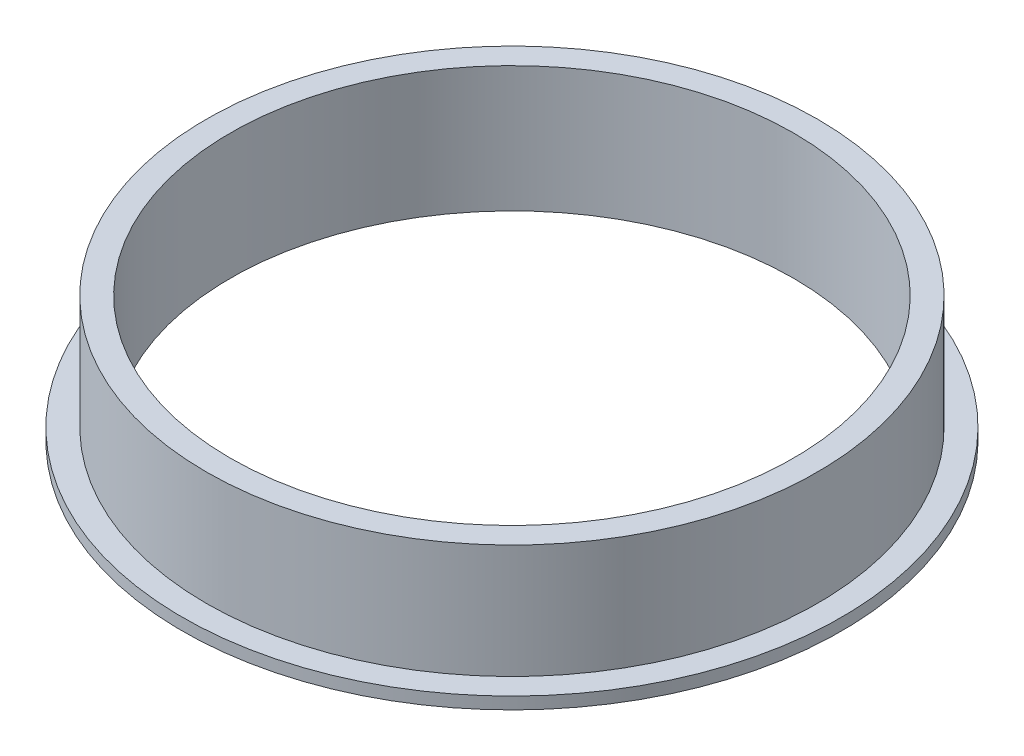
ISO-10303-21;
HEADER;
FILE_DESCRIPTION(('STEP AP214'),'2;1');
FILE_NAME('part.step','',(''),(''),'','','');
FILE_SCHEMA(('AUTOMOTIVE_DESIGN { 1 0 10303 214 1 1 1 1 }'));
ENDSEC;
DATA;
#1=APPLICATION_CONTEXT('core data for automotive mechanical design processes');
#2=APPLICATION_PROTOCOL_DEFINITION('international standard','automotive_design',2000,#1);
#3=PRODUCT_CONTEXT('',#1,'mechanical');
#4=PRODUCT('Part','Part','',(#3));
#5=PRODUCT_RELATED_PRODUCT_CATEGORY('part','',(#4));
#6=PRODUCT_DEFINITION_FORMATION('','',#4);
#7=PRODUCT_DEFINITION_CONTEXT('part definition',#1,'design');
#8=PRODUCT_DEFINITION('design','',#6,#7);
#9=PRODUCT_DEFINITION_SHAPE('','',#8);
#10=(LENGTH_UNIT() NAMED_UNIT(*) SI_UNIT(.MILLI.,.METRE.));
#11=(NAMED_UNIT(*) PLANE_ANGLE_UNIT() SI_UNIT($,.RADIAN.));
#12=(NAMED_UNIT(*) SI_UNIT($,.STERADIAN.) SOLID_ANGLE_UNIT());
#13=UNCERTAINTY_MEASURE_WITH_UNIT(LENGTH_MEASURE(1.E-05),#10,'distance_accuracy_value','');
#14=(GEOMETRIC_REPRESENTATION_CONTEXT(3) GLOBAL_UNCERTAINTY_ASSIGNED_CONTEXT((#13)) GLOBAL_UNIT_ASSIGNED_CONTEXT((#10,
#11,#12)) REPRESENTATION_CONTEXT('',''));
#15=CARTESIAN_POINT('',(0.,0.,0.));
#16=DIRECTION('',(0.,0.,1.));
#17=DIRECTION('',(1.,0.,0.));
#18=AXIS2_PLACEMENT_3D('',#15,#16,#17);
#19=CARTESIAN_POINT('',(0.,-10.5,0.));
#20=DIRECTION('',(0.,1.,0.));
#21=DIRECTION('',(0.,0.,1.));
#22=AXIS2_PLACEMENT_3D('',#19,#20,#21);
#23=CYLINDRICAL_SURFACE('',#22,25.5);
#24=CARTESIAN_POINT('',(0.,0.,0.));
#25=DIRECTION('',(0.,1.,0.));
#26=DIRECTION('',(1.,0.,0.));
#27=AXIS2_PLACEMENT_3D('',#24,#25,#26);
#28=CIRCLE('',#27,25.5);
#29=CARTESIAN_POINT('',(0.,0.,25.5));
#30=VERTEX_POINT('',#29);
#31=EDGE_CURVE('E11',#30,#30,#28,.T.);
#32=CARTESIAN_POINT('',(0.,-9.5,0.));
#33=DIRECTION('',(0.,-1.,0.));
#34=DIRECTION('',(0.,0.,-1.));
#35=AXIS2_PLACEMENT_3D('',#32,#33,#34);
#36=CIRCLE('',#35,25.5);
#37=CARTESIAN_POINT('',(0.,-9.5,25.5));
#38=VERTEX_POINT('',#37);
#39=EDGE_CURVE('E71',#38,#38,#36,.T.);
#40=CARTESIAN_POINT('',(0.,0.,25.5));
#41=CARTESIAN_POINT('',(0.,-0.0989583333333334,25.5));
#42=CARTESIAN_POINT('',(0.,-0.197916666666667,25.5));
#43=CARTESIAN_POINT('',(0.,-0.395833333333334,25.5));
#44=CARTESIAN_POINT('',(0.,-0.494791666666667,25.5));
#45=CARTESIAN_POINT('',(0.,-0.692708333333334,25.5));
#46=CARTESIAN_POINT('',(0.,-0.791666666666667,25.5));
#47=CARTESIAN_POINT('',(0.,-0.989583333333334,25.5));
#48=CARTESIAN_POINT('',(0.,-1.08854166666667,25.5));
#49=CARTESIAN_POINT('',(0.,-1.28645833333333,25.5));
#50=CARTESIAN_POINT('',(0.,-1.38541666666667,25.5));
#51=CARTESIAN_POINT('',(0.,-1.58333333333333,25.5));
#52=CARTESIAN_POINT('',(0.,-1.68229166666667,25.5));
#53=CARTESIAN_POINT('',(0.,-1.88020833333333,25.5));
#54=CARTESIAN_POINT('',(0.,-1.97916666666667,25.5));
#55=CARTESIAN_POINT('',(0.,-2.17708333333333,25.5));
#56=CARTESIAN_POINT('',(0.,-2.27604166666667,25.5));
#57=CARTESIAN_POINT('',(0.,-2.47395833333333,25.5));
#58=CARTESIAN_POINT('',(0.,-2.57291666666667,25.5));
#59=CARTESIAN_POINT('',(0.,-2.77083333333333,25.5));
#60=CARTESIAN_POINT('',(0.,-2.86979166666667,25.5));
#61=CARTESIAN_POINT('',(0.,-3.06770833333333,25.5));
#62=CARTESIAN_POINT('',(0.,-3.16666666666667,25.5));
#63=CARTESIAN_POINT('',(0.,-3.36458333333333,25.5));
#64=CARTESIAN_POINT('',(0.,-3.46354166666667,25.5));
#65=CARTESIAN_POINT('',(0.,-3.66145833333333,25.5));
#66=CARTESIAN_POINT('',(0.,-3.76041666666667,25.5));
#67=CARTESIAN_POINT('',(0.,-3.95833333333333,25.5));
#68=CARTESIAN_POINT('',(0.,-4.05729166666667,25.5));
#69=CARTESIAN_POINT('',(0.,-4.25520833333333,25.5));
#70=CARTESIAN_POINT('',(0.,-4.35416666666667,25.5));
#71=CARTESIAN_POINT('',(0.,-4.55208333333333,25.5));
#72=CARTESIAN_POINT('',(0.,-4.65104166666667,25.5));
#73=CARTESIAN_POINT('',(0.,-4.84895833333333,25.5));
#74=CARTESIAN_POINT('',(0.,-4.94791666666667,25.5));
#75=CARTESIAN_POINT('',(0.,-5.14583333333333,25.5));
#76=CARTESIAN_POINT('',(0.,-5.24479166666667,25.5));
#77=CARTESIAN_POINT('',(0.,-5.44270833333333,25.5));
#78=CARTESIAN_POINT('',(0.,-5.54166666666667,25.5));
#79=CARTESIAN_POINT('',(0.,-5.73958333333333,25.5));
#80=CARTESIAN_POINT('',(0.,-5.83854166666667,25.5));
#81=CARTESIAN_POINT('',(0.,-6.03645833333333,25.5));
#82=CARTESIAN_POINT('',(0.,-6.13541666666667,25.5));
#83=CARTESIAN_POINT('',(0.,-6.33333333333333,25.5));
#84=CARTESIAN_POINT('',(0.,-6.43229166666667,25.5));
#85=CARTESIAN_POINT('',(0.,-6.63020833333333,25.5));
#86=CARTESIAN_POINT('',(0.,-6.72916666666667,25.5));
#87=CARTESIAN_POINT('',(0.,-6.92708333333333,25.5));
#88=CARTESIAN_POINT('',(0.,-7.02604166666667,25.5));
#89=CARTESIAN_POINT('',(0.,-7.22395833333333,25.5));
#90=CARTESIAN_POINT('',(0.,-7.32291666666667,25.5));
#91=CARTESIAN_POINT('',(0.,-7.52083333333333,25.5));
#92=CARTESIAN_POINT('',(0.,-7.61979166666667,25.5));
#93=CARTESIAN_POINT('',(0.,-7.81770833333333,25.5));
#94=CARTESIAN_POINT('',(0.,-7.91666666666667,25.5));
#95=CARTESIAN_POINT('',(0.,-8.11458333333333,25.5));
#96=CARTESIAN_POINT('',(0.,-8.21354166666667,25.5));
#97=CARTESIAN_POINT('',(0.,-8.41145833333333,25.5));
#98=CARTESIAN_POINT('',(0.,-8.51041666666667,25.5));
#99=CARTESIAN_POINT('',(0.,-8.70833333333333,25.5));
#100=CARTESIAN_POINT('',(0.,-8.80729166666667,25.5));
#101=CARTESIAN_POINT('',(0.,-9.00520833333333,25.5));
#102=CARTESIAN_POINT('',(0.,-9.10416666666667,25.5));
#103=CARTESIAN_POINT('',(0.,-9.30208333333333,25.5));
#104=CARTESIAN_POINT('',(0.,-9.40104166666667,25.5));
#105=CARTESIAN_POINT('',(0.,-9.5,25.5));
#106=B_SPLINE_CURVE_WITH_KNOTS('',3,(#40,#41,#42,#43,#44,#45,#46,#47,#48,#49,#50,#51,#52,#53,
#54,#55,#56,#57,#58,#59,#60,#61,#62,#63,#64,#65,#66,#67,#68,#69,#70,#71,#72,#73,#74,#75,#76,#77,
#78,#79,#80,#81,#82,#83,#84,#85,#86,#87,#88,#89,#90,#91,#92,#93,#94,#95,#96,#97,#98,#99,#100,
#101,#102,#103,#104,#105),.UNSPECIFIED.,.F.,.F.,(4,2,2,2,2,2,2,2,2,2,2,2,2,2,2,2,2,2,2,2,2,2,2,
2,2,2,2,2,2,2,2,2,4),(0.,0.296875,0.593750000000001,0.890625000000001,1.1875,1.484375,1.78125,
2.078125,2.375,2.671875,2.96875,3.265625,3.5625,3.859375,4.15625,4.453125,4.75,5.046875,5.34375,
5.640625,5.9375,6.234375,6.53125,6.828125,7.125,7.421875,7.71875,8.015625,8.3125,8.609375,
8.90625,9.203125,9.5),.UNSPECIFIED.);
#107=EDGE_CURVE('BSEAM51',#30,#38,#106,.T.);
#108=ORIENTED_EDGE('',*,*,#31,.F.);
#109=ORIENTED_EDGE('',*,*,#39,.F.);
#110=ORIENTED_EDGE('',*,*,#107,.T.);
#111=ORIENTED_EDGE('',*,*,#107,.F.);
#112=EDGE_LOOP('',(#108,#110,#109,#111));
#113=FACE_BOUND('',#112,.T.);
#114=ADVANCED_FACE('F51',(#113),#23,.T.);
#115=CARTESIAN_POINT('',(0.,-10.5,0.));
#116=DIRECTION('',(0.,1.,0.));
#117=DIRECTION('',(0.,0.,1.));
#118=AXIS2_PLACEMENT_3D('',#115,#116,#117);
#119=PLANE('',#118);
#120=CARTESIAN_POINT('',(0.,-10.5,0.));
#121=DIRECTION('',(0.,1.,0.));
#122=DIRECTION('',(0.,0.,1.));
#123=AXIS2_PLACEMENT_3D('',#120,#121,#122);
#124=CIRCLE('',#123,23.5);
#125=CARTESIAN_POINT('',(0.,-10.5,23.5));
#126=VERTEX_POINT('',#125);
#127=EDGE_CURVE('E57',#126,#126,#124,.T.);
#128=ORIENTED_EDGE('',*,*,#127,.T.);
#129=EDGE_LOOP('',(#128));
#130=FACE_BOUND('',#129,.T.);
#131=CARTESIAN_POINT('',(0.,-10.5,0.));
#132=DIRECTION('',(0.,-1.,0.));
#133=DIRECTION('',(-1.,0.,0.));
#134=AXIS2_PLACEMENT_3D('',#131,#132,#133);
#135=CIRCLE('',#134,27.5);
#136=CARTESIAN_POINT('',(-27.5,-10.5,0.));
#137=VERTEX_POINT('',#136);
#138=EDGE_CURVE('E68',#137,#137,#135,.T.);
#139=ORIENTED_EDGE('',*,*,#138,.T.);
#140=EDGE_LOOP('',(#139));
#141=FACE_BOUND('',#140,.T.);
#142=ADVANCED_FACE('F81',(#130,#141),#119,.F.);
#143=CARTESIAN_POINT('',(0.,0.,0.));
#144=DIRECTION('',(0.,1.,0.));
#145=DIRECTION('',(0.,0.,1.));
#146=AXIS2_PLACEMENT_3D('',#143,#144,#145);
#147=PLANE('',#146);
#148=CARTESIAN_POINT('',(0.,0.,0.));
#149=DIRECTION('',(0.,1.,0.));
#150=DIRECTION('',(0.,0.,1.));
#151=AXIS2_PLACEMENT_3D('',#148,#149,#150);
#152=CIRCLE('',#151,23.5);
#153=CARTESIAN_POINT('',(0.,0.,23.5));
#154=VERTEX_POINT('',#153);
#155=EDGE_CURVE('E61',#154,#154,#152,.T.);
#156=ORIENTED_EDGE('',*,*,#155,.F.);
#157=EDGE_LOOP('',(#156));
#158=FACE_BOUND('',#157,.T.);
#159=ORIENTED_EDGE('',*,*,#31,.T.);
#160=EDGE_LOOP('',(#159));
#161=FACE_BOUND('',#160,.T.);
#162=ADVANCED_FACE('F87',(#158,#161),#147,.T.);
#163=CARTESIAN_POINT('',(0.,-10.5,0.));
#164=DIRECTION('',(0.,1.,0.));
#165=DIRECTION('',(0.,0.,1.));
#166=AXIS2_PLACEMENT_3D('',#163,#164,#165);
#167=CYLINDRICAL_SURFACE('',#166,23.5);
#168=CARTESIAN_POINT('',(0.,-10.5,23.5));
#169=CARTESIAN_POINT('',(0.,-10.390625,23.5));
#170=CARTESIAN_POINT('',(0.,-10.28125,23.5));
#171=CARTESIAN_POINT('',(0.,-10.0625,23.5));
#172=CARTESIAN_POINT('',(0.,-9.953125,23.5));
#173=CARTESIAN_POINT('',(0.,-9.734375,23.5));
#174=CARTESIAN_POINT('',(0.,-9.625,23.5));
#175=CARTESIAN_POINT('',(0.,-9.40625,23.5));
#176=CARTESIAN_POINT('',(0.,-9.296875,23.5));
#177=CARTESIAN_POINT('',(0.,-9.078125,23.5));
#178=CARTESIAN_POINT('',(0.,-8.96875,23.5));
#179=CARTESIAN_POINT('',(0.,-8.75,23.5));
#180=CARTESIAN_POINT('',(0.,-8.640625,23.5));
#181=CARTESIAN_POINT('',(0.,-8.421875,23.5));
#182=CARTESIAN_POINT('',(0.,-8.3125,23.5));
#183=CARTESIAN_POINT('',(0.,-8.09375,23.5));
#184=CARTESIAN_POINT('',(0.,-7.984375,23.5));
#185=CARTESIAN_POINT('',(0.,-7.765625,23.5));
#186=CARTESIAN_POINT('',(0.,-7.65625,23.5));
#187=CARTESIAN_POINT('',(0.,-7.4375,23.5));
#188=CARTESIAN_POINT('',(0.,-7.328125,23.5));
#189=CARTESIAN_POINT('',(0.,-7.109375,23.5));
#190=CARTESIAN_POINT('',(0.,-7.,23.5));
#191=CARTESIAN_POINT('',(0.,-6.78125,23.5));
#192=CARTESIAN_POINT('',(0.,-6.671875,23.5));
#193=CARTESIAN_POINT('',(0.,-6.453125,23.5));
#194=CARTESIAN_POINT('',(0.,-6.34375,23.5));
#195=CARTESIAN_POINT('',(0.,-6.125,23.5));
#196=CARTESIAN_POINT('',(0.,-6.015625,23.5));
#197=CARTESIAN_POINT('',(0.,-5.796875,23.5));
#198=CARTESIAN_POINT('',(0.,-5.6875,23.5));
#199=CARTESIAN_POINT('',(0.,-5.46875,23.5));
#200=CARTESIAN_POINT('',(0.,-5.359375,23.5));
#201=CARTESIAN_POINT('',(0.,-5.140625,23.5));
#202=CARTESIAN_POINT('',(0.,-5.03125,23.5));
#203=CARTESIAN_POINT('',(0.,-4.8125,23.5));
#204=CARTESIAN_POINT('',(0.,-4.703125,23.5));
#205=CARTESIAN_POINT('',(0.,-4.484375,23.5));
#206=CARTESIAN_POINT('',(0.,-4.375,23.5));
#207=CARTESIAN_POINT('',(0.,-4.15625,23.5));
#208=CARTESIAN_POINT('',(0.,-4.046875,23.5));
#209=CARTESIAN_POINT('',(0.,-3.828125,23.5));
#210=CARTESIAN_POINT('',(0.,-3.71875,23.5));
#211=CARTESIAN_POINT('',(0.,-3.5,23.5));
#212=CARTESIAN_POINT('',(0.,-3.390625,23.5));
#213=CARTESIAN_POINT('',(0.,-3.171875,23.5));
#214=CARTESIAN_POINT('',(0.,-3.0625,23.5));
#215=CARTESIAN_POINT('',(0.,-2.84375,23.5));
#216=CARTESIAN_POINT('',(0.,-2.734375,23.5));
#217=CARTESIAN_POINT('',(0.,-2.515625,23.5));
#218=CARTESIAN_POINT('',(0.,-2.40625,23.5));
#219=CARTESIAN_POINT('',(0.,-2.1875,23.5));
#220=CARTESIAN_POINT('',(0.,-2.078125,23.5));
#221=CARTESIAN_POINT('',(0.,-1.859375,23.5));
#222=CARTESIAN_POINT('',(0.,-1.75,23.5));
#223=CARTESIAN_POINT('',(0.,-1.53125,23.5));
#224=CARTESIAN_POINT('',(0.,-1.421875,23.5));
#225=CARTESIAN_POINT('',(0.,-1.203125,23.5));
#226=CARTESIAN_POINT('',(0.,-1.09375,23.5));
#227=CARTESIAN_POINT('',(0.,-0.875000000000001,23.5));
#228=CARTESIAN_POINT('',(0.,-0.765625000000001,23.5));
#229=CARTESIAN_POINT('',(0.,-0.546875,23.5));
#230=CARTESIAN_POINT('',(0.,-0.4375,23.5));
#231=CARTESIAN_POINT('',(0.,-0.21875,23.5));
#232=CARTESIAN_POINT('',(0.,-0.109375,23.5));
#233=CARTESIAN_POINT('',(0.,0.,23.5));
#234=B_SPLINE_CURVE_WITH_KNOTS('',3,(#168,#169,#170,#171,#172,#173,#174,#175,#176,#177,#178,
#179,#180,#181,#182,#183,#184,#185,#186,#187,#188,#189,#190,#191,#192,#193,#194,#195,#196,#197,
#198,#199,#200,#201,#202,#203,#204,#205,#206,#207,#208,#209,#210,#211,#212,#213,#214,#215,#216,
#217,#218,#219,#220,#221,#222,#223,#224,#225,#226,#227,#228,#229,#230,#231,#232,#233),
.UNSPECIFIED.,.F.,.F.,(4,2,2,2,2,2,2,2,2,2,2,2,2,2,2,2,2,2,2,2,2,2,2,2,2,2,2,2,2,2,2,2,4),(0.,
0.328125,0.656250000000001,0.984375000000001,1.3125,1.640625,1.96875,2.296875,2.625,2.953125,
3.28125,3.609375,3.9375,4.265625,4.59375,4.921875,5.25,5.578125,5.90625,6.234375,6.5625,
6.890625,7.21875,7.546875,7.875,8.203125,8.53125,8.859375,9.1875,9.515625,9.84375,10.171875,
10.5),.UNSPECIFIED.);
#235=EDGE_CURVE('BSEAM93',#126,#154,#234,.T.);
#236=ORIENTED_EDGE('',*,*,#127,.F.);
#237=ORIENTED_EDGE('',*,*,#155,.T.);
#238=ORIENTED_EDGE('',*,*,#235,.T.);
#239=ORIENTED_EDGE('',*,*,#235,.F.);
#240=EDGE_LOOP('',(#236,#238,#237,#239));
#241=FACE_BOUND('',#240,.T.);
#242=ADVANCED_FACE('F93',(#241),#167,.F.);
#243=CARTESIAN_POINT('',(0.,-9.5,0.));
#244=DIRECTION('',(0.,-1.,0.));
#245=DIRECTION('',(0.,0.,-1.));
#246=AXIS2_PLACEMENT_3D('',#243,#244,#245);
#247=CYLINDRICAL_SURFACE('',#246,27.5);
#248=CARTESIAN_POINT('',(0.,-9.5,0.));
#249=DIRECTION('',(0.,-1.,0.));
#250=DIRECTION('',(-1.,0.,0.));
#251=AXIS2_PLACEMENT_3D('',#248,#249,#250);
#252=CIRCLE('',#251,27.5);
#253=CARTESIAN_POINT('',(-27.5,-9.5,0.));
#254=VERTEX_POINT('',#253);
#255=EDGE_CURVE('E66',#254,#254,#252,.T.);
#256=ORIENTED_EDGE('',*,*,#255,.T.);
#257=EDGE_LOOP('',(#256));
#258=FACE_BOUND('',#257,.T.);
#259=ORIENTED_EDGE('',*,*,#138,.F.);
#260=EDGE_LOOP('',(#259));
#261=FACE_BOUND('',#260,.T.);
#262=ADVANCED_FACE('F98',(#258,#261),#247,.T.);
#263=CARTESIAN_POINT('',(0.,-9.5,0.));
#264=DIRECTION('',(0.,-1.,0.));
#265=DIRECTION('',(0.,0.,-1.));
#266=AXIS2_PLACEMENT_3D('',#263,#264,#265);
#267=PLANE('',#266);
#268=ORIENTED_EDGE('',*,*,#39,.T.);
#269=EDGE_LOOP('',(#268));
#270=FACE_BOUND('',#269,.T.);
#271=ORIENTED_EDGE('',*,*,#255,.F.);
#272=EDGE_LOOP('',(#271));
#273=FACE_BOUND('',#272,.T.);
#274=ADVANCED_FACE('F77',(#270,#273),#267,.F.);
#275=CLOSED_SHELL('',(#114,#142,#162,#242,#262,#274));
#276=MANIFOLD_SOLID_BREP('B2',#275);
#277=ADVANCED_BREP_SHAPE_REPRESENTATION('',(#18,#276),#14);
#278=SHAPE_DEFINITION_REPRESENTATION(#9,#277);
ENDSEC;
END-ISO-10303-21;
